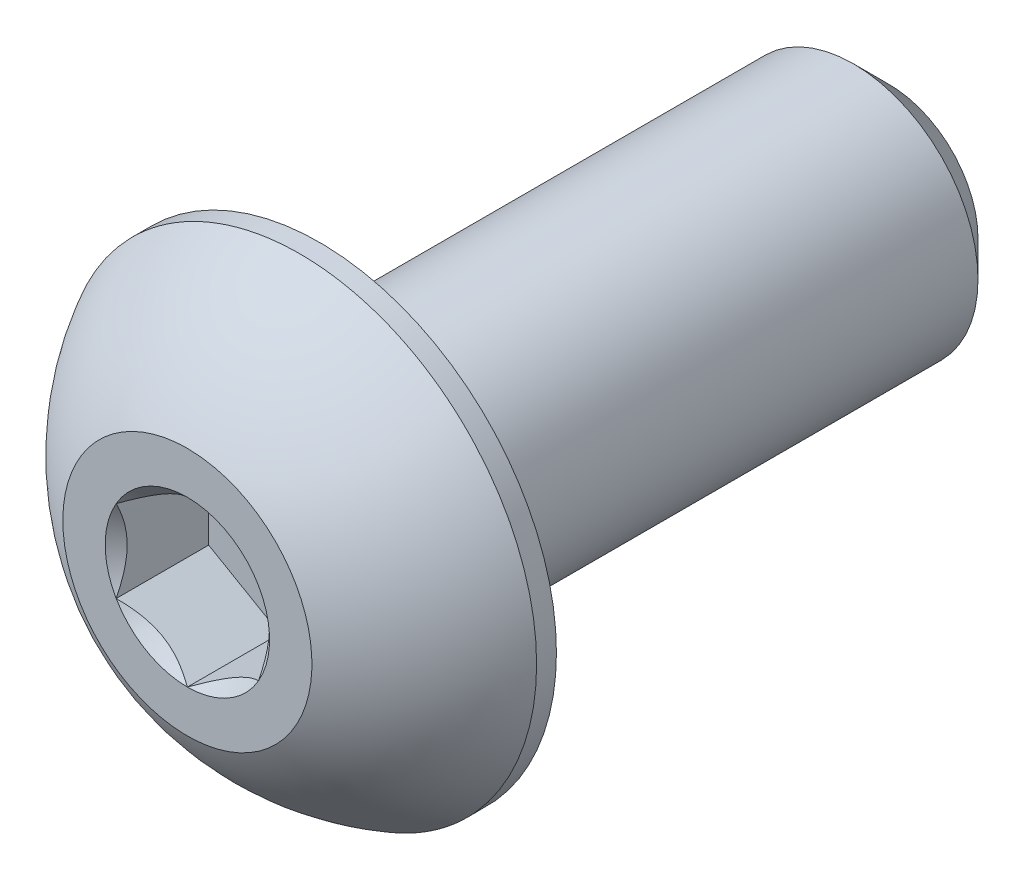
ISO-10303-21;
HEADER;
FILE_DESCRIPTION(('STEP AP214'),'2;1');
FILE_NAME('part.step','',(''),(''),'','','');
FILE_SCHEMA(('AUTOMOTIVE_DESIGN { 1 0 10303 214 1 1 1 1 }'));
ENDSEC;
DATA;
#1=APPLICATION_CONTEXT('core data for automotive mechanical design processes');
#2=APPLICATION_PROTOCOL_DEFINITION('international standard','automotive_design',2000,#1);
#3=PRODUCT_CONTEXT('',#1,'mechanical');
#4=PRODUCT('Part','Part','',(#3));
#5=PRODUCT_RELATED_PRODUCT_CATEGORY('part','',(#4));
#6=PRODUCT_DEFINITION_FORMATION('','',#4);
#7=PRODUCT_DEFINITION_CONTEXT('part definition',#1,'design');
#8=PRODUCT_DEFINITION('design','',#6,#7);
#9=PRODUCT_DEFINITION_SHAPE('','',#8);
#10=(LENGTH_UNIT() NAMED_UNIT(*) SI_UNIT(.MILLI.,.METRE.));
#11=(NAMED_UNIT(*) PLANE_ANGLE_UNIT() SI_UNIT($,.RADIAN.));
#12=(NAMED_UNIT(*) SI_UNIT($,.STERADIAN.) SOLID_ANGLE_UNIT());
#13=UNCERTAINTY_MEASURE_WITH_UNIT(LENGTH_MEASURE(1.E-05),#10,'distance_accuracy_value','');
#14=(GEOMETRIC_REPRESENTATION_CONTEXT(3) GLOBAL_UNCERTAINTY_ASSIGNED_CONTEXT((#13)) GLOBAL_UNIT_ASSIGNED_CONTEXT((#10,
#11,#12)) REPRESENTATION_CONTEXT('',''));
#15=CARTESIAN_POINT('',(0.,0.,0.));
#16=DIRECTION('',(0.,0.,1.));
#17=DIRECTION('',(1.,0.,0.));
#18=AXIS2_PLACEMENT_3D('',#15,#16,#17);
#19=CARTESIAN_POINT('',(1.190625,-0.687407664253898,-1.54686));
#20=DIRECTION('',(1.,0.,0.));
#21=DIRECTION('',(0.,0.,-1.));
#22=AXIS2_PLACEMENT_3D('',#19,#20,#21);
#23=PLANE('',#22);
#24=CARTESIAN_POINT('',(1.190625,0.687407664259233,-7.3339844687733E-12));
#25=CARTESIAN_POINT('',(1.190625,0.640463282058557,-0.0234502898053729));
#26=CARTESIAN_POINT('',(1.190625,0.59273899138342,-0.0455313138724906));
#27=CARTESIAN_POINT('',(1.190625,0.495406225240185,-0.0860062769801569));
#28=CARTESIAN_POINT('',(1.190625,0.445787629548574,-0.104375663617782));
#29=CARTESIAN_POINT('',(1.190625,0.345116375780404,-0.136095646290021));
#30=CARTESIAN_POINT('',(1.190625,0.294069215524812,-0.149463227506415));
#31=CARTESIAN_POINT('',(1.190625,0.190855854747494,-0.170043196665587));
#32=CARTESIAN_POINT('',(1.190625,0.138693633062727,-0.177274618626966));
#33=CARTESIAN_POINT('',(1.190625,0.0719511129764623,-0.182105338423632));
#34=CARTESIAN_POINT('',(1.190625,0.0575681066386955,-0.182886314662907));
#35=CARTESIAN_POINT('',(1.190625,0.0287907386926829,-0.183928904231108));
#36=CARTESIAN_POINT('',(1.190625,0.0143963875093465,-0.184190799693201));
#37=CARTESIAN_POINT('',(1.190625,-0.0361321030415034,-0.184189145960145));
#38=CARTESIAN_POINT('',(1.190625,-0.0722770331313801,-0.182535286211369));
#39=CARTESIAN_POINT('',(1.190625,-0.144284982569764,-0.176018069262139));
#40=CARTESIAN_POINT('',(1.190625,-0.180147787625385,-0.17115247351411));
#41=CARTESIAN_POINT('',(1.190625,-0.287258251635286,-0.152042262333456));
#42=CARTESIAN_POINT('',(1.190625,-0.357725297303742,-0.133287464347425));
#43=CARTESIAN_POINT('',(1.190625,-0.471552892405715,-0.0949199784628261));
#44=CARTESIAN_POINT('',(1.190625,-0.515840765871925,-0.0778592533991065));
#45=CARTESIAN_POINT('',(1.190625,-0.602739573087872,-0.0408831575921345));
#46=CARTESIAN_POINT('',(1.190625,-0.64536213992437,-0.0209953241872319));
#47=CARTESIAN_POINT('',(1.190625,-0.687407664259233,-7.3341207716749E-12));
#48=B_SPLINE_CURVE_WITH_KNOTS('',3,(#24,#25,#26,#27,#28,#29,#30,#31,#32,#33,#34,#35,#36,#37,#38,
#39,#40,#41,#42,#43,#44,#45,#46,#47),.UNSPECIFIED.,.F.,.F.,(4,2,2,2,2,2,2,2,2,2,2,4),(0.,
0.15753540310306,0.316081041460021,0.474083294580132,0.631593623087315,0.674799715051238,
0.71798231699486,0.826362160341962,0.934817623221276,1.1526245104714,1.29491478051943,
1.43590359047286),.UNSPECIFIED.);
#49=CARTESIAN_POINT('',(1.19062500000866,0.687407664251565,-3.66699461121871E-12));
#50=VERTEX_POINT('',#49);
#51=CARTESIAN_POINT('',(1.19062500000433,-0.687407664256399,-5.00084731799153E-12));
#52=VERTEX_POINT('',#51);
#53=EDGE_CURVE('E20',#50,#52,#48,.T.);
#54=ORIENTED_EDGE('',*,*,#53,.F.);
#55=DIRECTION('',(0.,0.,1.));
#56=VECTOR('',#55,1.);
#57=CARTESIAN_POINT('',(1.190625,0.687407664253899,-1.54686));
#58=LINE('',#57,#56);
#59=CARTESIAN_POINT('',(1.190625,0.687407664253899,-1.54686));
#60=VERTEX_POINT('',#59);
#61=EDGE_CURVE('E68',#50,#60,#58,.F.);
#62=ORIENTED_EDGE('',*,*,#61,.T.);
#63=DIRECTION('',(0.,1.,0.));
#64=VECTOR('',#63,1.);
#65=CARTESIAN_POINT('',(1.190625,-0.687407664253898,-1.54686));
#66=LINE('',#65,#64);
#67=CARTESIAN_POINT('',(1.190625,-0.687407664253898,-1.54686));
#68=VERTEX_POINT('',#67);
#69=EDGE_CURVE('E74',#68,#60,#66,.T.);
#70=ORIENTED_EDGE('',*,*,#69,.F.);
#71=DIRECTION('',(0.,0.,1.));
#72=VECTOR('',#71,1.);
#73=CARTESIAN_POINT('',(1.190625,-0.687407664253898,-1.54686));
#74=LINE('',#73,#72);
#75=EDGE_CURVE('E71',#68,#52,#74,.T.);
#76=ORIENTED_EDGE('',*,*,#75,.T.);
#77=EDGE_LOOP('',(#54,#62,#70,#76));
#78=FACE_BOUND('',#77,.T.);
#79=ADVANCED_FACE('F16',(#78),#23,.F.);
#80=CARTESIAN_POINT('',(1.190625,-0.687407664253898,-1.54686));
#81=DIRECTION('',(0.,0.,1.));
#82=DIRECTION('',(1.,0.,0.));
#83=AXIS2_PLACEMENT_3D('',#80,#81,#82);
#84=PLANE('',#83);
#85=DIRECTION('',(0.,1.,0.));
#86=VECTOR('',#85,1.);
#87=CARTESIAN_POINT('',(-1.190625,0.687407664253898,-1.54686));
#88=LINE('',#87,#86);
#89=CARTESIAN_POINT('',(-1.190625,0.687407664253898,-1.54686));
#90=VERTEX_POINT('',#89);
#91=CARTESIAN_POINT('',(-1.190625,-0.687407664253898,-1.54686));
#92=VERTEX_POINT('',#91);
#93=EDGE_CURVE('E217',#90,#92,#88,.F.);
#94=ORIENTED_EDGE('',*,*,#93,.T.);
#95=DIRECTION('',(0.866025403784439,-0.5,0.));
#96=VECTOR('',#95,1.);
#97=CARTESIAN_POINT('',(-1.190625,-0.687407664253898,-1.54686));
#98=LINE('',#97,#96);
#99=CARTESIAN_POINT('',(0.,-1.3748153285078,-1.54686));
#100=VERTEX_POINT('',#99);
#101=EDGE_CURVE('E243',#92,#100,#98,.T.);
#102=ORIENTED_EDGE('',*,*,#101,.T.);
#103=DIRECTION('',(0.866025403784438,0.5,0.));
#104=VECTOR('',#103,1.);
#105=CARTESIAN_POINT('',(0.,-1.3748153285078,-1.54686));
#106=LINE('',#105,#104);
#107=EDGE_CURVE('E232',#100,#68,#106,.T.);
#108=ORIENTED_EDGE('',*,*,#107,.T.);
#109=ORIENTED_EDGE('',*,*,#69,.T.);
#110=DIRECTION('',(-0.866025403784439,0.5,0.));
#111=VECTOR('',#110,1.);
#112=CARTESIAN_POINT('',(1.190625,0.687407664253898,-1.54686));
#113=LINE('',#112,#111);
#114=CARTESIAN_POINT('',(0.,1.3748153285078,-1.54686));
#115=VERTEX_POINT('',#114);
#116=EDGE_CURVE('E81',#60,#115,#113,.T.);
#117=ORIENTED_EDGE('',*,*,#116,.T.);
#118=DIRECTION('',(-0.866025403784438,-0.500000000000001,0.));
#119=VECTOR('',#118,1.);
#120=CARTESIAN_POINT('',(0.,1.3748153285078,-1.54686));
#121=LINE('',#120,#119);
#122=EDGE_CURVE('E82',#115,#90,#121,.T.);
#123=ORIENTED_EDGE('',*,*,#122,.T.);
#124=EDGE_LOOP('',(#94,#102,#108,#109,#117,#123));
#125=FACE_BOUND('',#124,.T.);
#126=ADVANCED_FACE('F161',(#125),#84,.T.);
#127=CARTESIAN_POINT('',(-1.190625,-0.687407664253898,-1.54686));
#128=DIRECTION('',(-0.5,-0.866025403784439,0.));
#129=DIRECTION('',(0.866025403784439,-0.5,0.));
#130=AXIS2_PLACEMENT_3D('',#127,#128,#129);
#131=PLANE('',#130);
#132=CARTESIAN_POINT('',(-1.190625000005,-0.687407664251009,-7.11226691489281E-12));
#133=CARTESIAN_POINT('',(-1.14970263916546,-0.711034200297593,-0.0236038646769938));
#134=CARTESIAN_POINT('',(-1.10809605277264,-0.73505577415155,-0.0458212036469661));
#135=CARTESIAN_POINT('',(-1.02325595337568,-0.784038228376462,-0.0865002027034878));
#136=CARTESIAN_POINT('',(-0.980014376482455,-0.809003764435948,-0.104939236403414));
#137=CARTESIAN_POINT('',(-0.892819863395944,-0.859345540038303,-0.136525429378763));
#138=CARTESIAN_POINT('',(-0.848889120958567,-0.884708966010223,-0.149751957854468));
#139=CARTESIAN_POINT('',(-0.760060747152133,-0.935994051539044,-0.170129928587292));
#140=CARTESIAN_POINT('',(-0.715165827466802,-0.961914145504617,-0.177296576577547));
#141=CARTESIAN_POINT('',(-0.637785345269273,-1.00658978773138,-0.183763131592925));
#142=CARTESIAN_POINT('',(-0.605399644682964,-1.02528768068278,-0.184720050380429));
#143=CARTESIAN_POINT('',(-0.540685248506871,-1.06265055473549,-0.183105270887928));
#144=CARTESIAN_POINT('',(-0.508356567088664,-1.08131552765484,-0.180532793146412));
#145=CARTESIAN_POINT('',(-0.444011323014015,-1.11846527164241,-0.172007928559528));
#146=CARTESIAN_POINT('',(-0.411995078792538,-1.13694985886212,-0.166052398779168));
#147=CARTESIAN_POINT('',(-0.348497138622973,-1.17361041171201,-0.151082179001727));
#148=CARTESIAN_POINT('',(-0.317015678144512,-1.19178624139373,-0.142066176329257));
#149=CARTESIAN_POINT('',(-0.236423425587284,-1.23831620010224,-0.115320764312442));
#150=CARTESIAN_POINT('',(-0.187819783695938,-1.26637752583181,-0.0955839989520929));
#151=CARTESIAN_POINT('',(-0.0925140444359303,-1.32140232004889,-0.0511268607854128));
#152=CARTESIAN_POINT('',(-0.0458063370539672,-1.3483690274791,-0.0264227108261042));
#153=CARTESIAN_POINT('',(5.00481812795174E-12,-1.37481532851069,-7.11205201533462E-12));
#154=B_SPLINE_CURVE_WITH_KNOTS('',3,(#132,#133,#134,#135,#136,#137,#138,#139,#140,#141,#142,
#143,#144,#145,#146,#147,#148,#149,#150,#151,#152,#153),.UNSPECIFIED.,.F.,.F.,(4,2,2,2,2,2,2,2,
2,2,4),(0.,0.158570945741683,0.318065397746423,0.475027617147274,0.631594800912474,
0.743660160555296,0.855750273635721,0.96794469177711,1.08018729245045,1.2583629102598,
1.43596581389991),.UNSPECIFIED.);
#155=CARTESIAN_POINT('',(-1.19062500000433,-0.687407664256399,-5.0007317979836E-12));
#156=VERTEX_POINT('',#155);
#157=CARTESIAN_POINT('',(-6.15870822370063E-12,-1.37481532851424,-3.5559820357246E-12));
#158=VERTEX_POINT('',#157);
#159=EDGE_CURVE('E163',#156,#158,#154,.T.);
#160=ORIENTED_EDGE('',*,*,#159,.T.);
#161=DIRECTION('',(0.,0.,1.));
#162=VECTOR('',#161,1.);
#163=CARTESIAN_POINT('',(0.,-1.3748153285078,-1.54686));
#164=LINE('',#163,#162);
#165=EDGE_CURVE('E226',#158,#100,#164,.F.);
#166=ORIENTED_EDGE('',*,*,#165,.T.);
#167=ORIENTED_EDGE('',*,*,#101,.F.);
#168=DIRECTION('',(0.,0.,1.));
#169=VECTOR('',#168,1.);
#170=CARTESIAN_POINT('',(-1.190625,-0.687407664253898,-1.54686));
#171=LINE('',#170,#169);
#172=EDGE_CURVE('E213',#92,#156,#171,.T.);
#173=ORIENTED_EDGE('',*,*,#172,.T.);
#174=EDGE_LOOP('',(#160,#166,#167,#173));
#175=FACE_BOUND('',#174,.T.);
#176=ADVANCED_FACE('F157',(#175),#131,.F.);
#177=CARTESIAN_POINT('',(0.,-1.3748153285078,-1.54686));
#178=DIRECTION('',(0.5,-0.866025403784438,0.));
#179=DIRECTION('',(0.866025403784438,0.5,0.));
#180=AXIS2_PLACEMENT_3D('',#177,#178,#179);
#181=PLANE('',#180);
#182=CARTESIAN_POINT('',(-5.00401088023849E-12,-1.37481532851069,-7.11178287157497E-12));
#183=CARTESIAN_POINT('',(0.0409223608345363,-1.3511887924641,-0.023603864676993));
#184=CARTESIAN_POINT('',(0.0825289472273579,-1.32716721861015,-0.0458212036469651));
#185=CARTESIAN_POINT('',(0.167369046624322,-1.27818476438523,-0.0865002027034866));
#186=CARTESIAN_POINT('',(0.210610623517543,-1.25321922832575,-0.104939236403413));
#187=CARTESIAN_POINT('',(0.297805136604054,-1.20287745272339,-0.136525429378762));
#188=CARTESIAN_POINT('',(0.341735879041432,-1.17751402675147,-0.149751957854467));
#189=CARTESIAN_POINT('',(0.430564252847866,-1.12622894122265,-0.170129928587291));
#190=CARTESIAN_POINT('',(0.475459172533197,-1.10030884725708,-0.177296576577546));
#191=CARTESIAN_POINT('',(0.552839654730727,-1.05563320503031,-0.183763131592925));
#192=CARTESIAN_POINT('',(0.585225355317036,-1.03693531207891,-0.184720050380429));
#193=CARTESIAN_POINT('',(0.649939751493129,-0.9995724380262,-0.183105270887928));
#194=CARTESIAN_POINT('',(0.682268432911337,-0.980907465106852,-0.180532793146412));
#195=CARTESIAN_POINT('',(0.746613676985986,-0.943757721119281,-0.172007928559527));
#196=CARTESIAN_POINT('',(0.778629921207463,-0.925273133899571,-0.166052398779167));
#197=CARTESIAN_POINT('',(0.842127861377027,-0.888612581049686,-0.151082179001727));
#198=CARTESIAN_POINT('',(0.873609321855487,-0.870436751367964,-0.142066176329257));
#199=CARTESIAN_POINT('',(0.954201574412646,-0.823906792659491,-0.115320764312466));
#200=CARTESIAN_POINT('',(1.00280521630393,-0.795845466929964,-0.0955839989521483));
#201=CARTESIAN_POINT('',(1.0981109555638,-0.740820672712956,-0.0511268607855445));
#202=CARTESIAN_POINT('',(1.14481866294571,-0.713853965282785,-0.0264227108262798));
#203=CARTESIAN_POINT('',(1.19062500000462,-0.687407664251231,-7.33463655303277E-12));
#204=B_SPLINE_CURVE_WITH_KNOTS('',3,(#182,#183,#184,#185,#186,#187,#188,#189,#190,#191,#192,
#193,#194,#195,#196,#197,#198,#199,#200,#201,#202,#203),.UNSPECIFIED.,.F.,.F.,(4,2,2,2,2,2,2,2,
2,2,4),(0.,0.158570945741681,0.318065397746421,0.475027617147272,0.631594800912474,
0.743660160555296,0.855750273635722,0.96794469177711,1.08018729245045,1.25836291025955,
1.43596581389941),.UNSPECIFIED.);
#205=EDGE_CURVE('E91',#158,#52,#204,.T.);
#206=ORIENTED_EDGE('',*,*,#205,.T.);
#207=ORIENTED_EDGE('',*,*,#75,.F.);
#208=ORIENTED_EDGE('',*,*,#107,.F.);
#209=ORIENTED_EDGE('',*,*,#165,.F.);
#210=EDGE_LOOP('',(#206,#207,#208,#209));
#211=FACE_BOUND('',#210,.T.);
#212=ADVANCED_FACE('F152',(#211),#181,.F.);
#213=CARTESIAN_POINT('',(1.190625,0.687407664253898,-1.54686));
#214=DIRECTION('',(0.5,0.866025403784439,0.));
#215=DIRECTION('',(-0.866025403784439,0.5,0.));
#216=AXIS2_PLACEMENT_3D('',#213,#214,#215);
#217=PLANE('',#216);
#218=CARTESIAN_POINT('',(1.19062500000462,0.687407664251231,-7.33437717370688E-12));
#219=CARTESIAN_POINT('',(1.1497026391651,0.711034200297802,-0.0236038646771912));
#220=CARTESIAN_POINT('',(1.1080960527723,0.735055774151746,-0.0458212036471392));
#221=CARTESIAN_POINT('',(1.02325595337539,0.784038228376629,-0.0865002027036148));
#222=CARTESIAN_POINT('',(0.980014376482192,0.8090037644361,-0.10493923640352));
#223=CARTESIAN_POINT('',(0.892819863395734,0.859345540038425,-0.13652542937883));
#224=CARTESIAN_POINT('',(0.848889120958384,0.884708966010329,-0.149751957854517));
#225=CARTESIAN_POINT('',(0.760060747152006,0.935994051539118,-0.170129928587314));
#226=CARTESIAN_POINT('',(0.715165827466704,0.961914145504674,-0.177296576577559));
#227=CARTESIAN_POINT('',(0.637785345269205,1.00658978773142,-0.183763131592929));
#228=CARTESIAN_POINT('',(0.605399644682898,1.02528768068282,-0.18472005038043));
#229=CARTESIAN_POINT('',(0.540685248506807,1.06265055473553,-0.183105270887924));
#230=CARTESIAN_POINT('',(0.508356567088601,1.08131552765488,-0.180532793146406));
#231=CARTESIAN_POINT('',(0.444011323013955,1.11846527164245,-0.172007928559517));
#232=CARTESIAN_POINT('',(0.411995078792479,1.13694985886216,-0.166052398779156));
#233=CARTESIAN_POINT('',(0.348497138622918,1.17361041171204,-0.151082179001712));
#234=CARTESIAN_POINT('',(0.317015678144459,1.19178624139376,-0.142066176329241));
#235=CARTESIAN_POINT('',(0.236423425587241,1.23831620010227,-0.115320764312425));
#236=CARTESIAN_POINT('',(0.187819783695904,1.26637752583183,-0.0955839989520779));
#237=CARTESIAN_POINT('',(0.0925140444359133,1.3214023200489,-0.0511268607854038));
#238=CARTESIAN_POINT('',(0.0458063370539588,1.3483690274791,-0.0264227108260993));
#239=CARTESIAN_POINT('',(-5.00500883587113E-12,1.37481532851069,-7.11174099955472E-12));
#240=B_SPLINE_CURVE_WITH_KNOTS('',3,(#218,#219,#220,#221,#222,#223,#224,#225,#226,#227,#228,
#229,#230,#231,#232,#233,#234,#235,#236,#237,#238,#239),.UNSPECIFIED.,.F.,.F.,(4,2,2,2,2,2,2,2,
2,2,4),(0.,0.158570945741578,0.318065397746212,0.475027617146959,0.631594800912057,
0.743660160554875,0.855750273635295,0.96794469177668,1.08018729245002,1.25836291025933,
1.43596581389941),.UNSPECIFIED.);
#241=CARTESIAN_POINT('',(6.15862930115388E-12,1.37481532851424,-3.55585714870156E-12));
#242=VERTEX_POINT('',#241);
#243=EDGE_CURVE('E79',#50,#242,#240,.T.);
#244=ORIENTED_EDGE('',*,*,#243,.T.);
#245=DIRECTION('',(0.,0.,1.));
#246=VECTOR('',#245,1.);
#247=CARTESIAN_POINT('',(0.,1.3748153285078,-1.54686));
#248=LINE('',#247,#246);
#249=EDGE_CURVE('E220',#242,#115,#248,.F.);
#250=ORIENTED_EDGE('',*,*,#249,.T.);
#251=ORIENTED_EDGE('',*,*,#116,.F.);
#252=ORIENTED_EDGE('',*,*,#61,.F.);
#253=EDGE_LOOP('',(#244,#250,#251,#252));
#254=FACE_BOUND('',#253,.T.);
#255=ADVANCED_FACE('F76',(#254),#217,.F.);
#256=CARTESIAN_POINT('',(0.,1.3748153285078,-1.54686));
#257=DIRECTION('',(-0.500000000000001,0.866025403784438,0.));
#258=DIRECTION('',(-0.866025403784438,-0.500000000000001,0.));
#259=AXIS2_PLACEMENT_3D('',#256,#257,#258);
#260=PLANE('',#259);
#261=CARTESIAN_POINT('',(5.0036324711369E-12,1.37481532851069,-7.11193552624931E-12));
#262=CARTESIAN_POINT('',(-0.040922360834537,1.3511887924641,-0.0236038646769936));
#263=CARTESIAN_POINT('',(-0.0825289472273589,1.32716721861014,-0.0458212036469658));
#264=CARTESIAN_POINT('',(-0.167369046624323,1.27818476438523,-0.0865002027034875));
#265=CARTESIAN_POINT('',(-0.210610623517545,1.25321922832575,-0.104939236403414));
#266=CARTESIAN_POINT('',(-0.297805136604057,1.20287745272339,-0.136525429378763));
#267=CARTESIAN_POINT('',(-0.341735879041434,1.17751402675147,-0.149751957854468));
#268=CARTESIAN_POINT('',(-0.430564252847868,1.12622894122265,-0.170129928587292));
#269=CARTESIAN_POINT('',(-0.475459172533199,1.10030884725708,-0.177296576577547));
#270=CARTESIAN_POINT('',(-0.552839654730727,1.05563320503031,-0.183763131592925));
#271=CARTESIAN_POINT('',(-0.585225355317036,1.03693531207891,-0.18472005038043));
#272=CARTESIAN_POINT('',(-0.64993975149313,0.9995724380262,-0.183105270887928));
#273=CARTESIAN_POINT('',(-0.682268432911337,0.980907465106852,-0.180532793146412));
#274=CARTESIAN_POINT('',(-0.746613676985986,0.943757721119281,-0.172007928559528));
#275=CARTESIAN_POINT('',(-0.778629921207463,0.92527313389957,-0.166052398779168));
#276=CARTESIAN_POINT('',(-0.842127861377028,0.888612581049685,-0.151082179001727));
#277=CARTESIAN_POINT('',(-0.873609321855488,0.870436751367963,-0.142066176329257));
#278=CARTESIAN_POINT('',(-0.954201574412716,0.82390679265945,-0.115320764312442));
#279=CARTESIAN_POINT('',(-1.00280521630406,0.795845466929885,-0.095583998952093));
#280=CARTESIAN_POINT('',(-1.09811095556407,0.740820672712803,-0.0511268607854132));
#281=CARTESIAN_POINT('',(-1.14481866294603,0.713853965282597,-0.0264227108261046));
#282=CARTESIAN_POINT('',(-1.190625000005,0.687407664251009,-7.11256883288283E-12));
#283=B_SPLINE_CURVE_WITH_KNOTS('',3,(#261,#262,#263,#264,#265,#266,#267,#268,#269,#270,#271,
#272,#273,#274,#275,#276,#277,#278,#279,#280,#281,#282),.UNSPECIFIED.,.F.,.F.,(4,2,2,2,2,2,2,2,
2,2,4),(0.,0.158570945741683,0.318065397746423,0.475027617147274,0.631594800912475,
0.743660160555297,0.855750273635722,0.967944691777111,1.08018729245045,1.2583629102598,
1.43596581389991),.UNSPECIFIED.);
#284=CARTESIAN_POINT('',(-1.1906250000025,0.687407664262455,-3.55622701201348E-12));
#285=VERTEX_POINT('',#284);
#286=EDGE_CURVE('E39',#242,#285,#283,.T.);
#287=ORIENTED_EDGE('',*,*,#286,.T.);
#288=DIRECTION('',(0.,0.,1.));
#289=VECTOR('',#288,1.);
#290=CARTESIAN_POINT('',(-1.190625,0.687407664253898,-1.54686));
#291=LINE('',#290,#289);
#292=EDGE_CURVE('E167',#285,#90,#291,.F.);
#293=ORIENTED_EDGE('',*,*,#292,.T.);
#294=ORIENTED_EDGE('',*,*,#122,.F.);
#295=ORIENTED_EDGE('',*,*,#249,.F.);
#296=EDGE_LOOP('',(#287,#293,#294,#295));
#297=FACE_BOUND('',#296,.T.);
#298=ADVANCED_FACE('F151',(#297),#260,.F.);
#299=CARTESIAN_POINT('',(-1.190625,0.687407664253898,-1.54686));
#300=DIRECTION('',(-1.,0.,0.));
#301=DIRECTION('',(0.,0.,1.));
#302=AXIS2_PLACEMENT_3D('',#299,#300,#301);
#303=PLANE('',#302);
#304=CARTESIAN_POINT('',(-1.190625,0.687407664259677,-7.11228319583856E-12));
#305=CARTESIAN_POINT('',(-1.190625,0.640154592154,-0.0236038646760217));
#306=CARTESIAN_POINT('',(-1.190625,0.592111444433501,-0.0458212036445066));
#307=CARTESIAN_POINT('',(-1.190625,0.494146535958518,-0.0865002026966673));
#308=CARTESIAN_POINT('',(-1.190625,0.444215463826976,-0.104939236393717));
#309=CARTESIAN_POINT('',(-1.190625,0.343531912597786,-0.136525429361613));
#310=CARTESIAN_POINT('',(-1.190625,0.292805060642044,-0.149751957832793));
#311=CARTESIAN_POINT('',(-1.190625,0.190234889561206,-0.170129928554993));
#312=CARTESIAN_POINT('',(-1.190625,0.138394701618765,-0.177296576539151));
#313=CARTESIAN_POINT('',(-1.190625,0.0490434171390508,-0.183763131543683));
#314=CARTESIAN_POINT('',(-1.190625,0.0116476312210965,-0.184720050325996));
#315=CARTESIAN_POINT('',(-1.190625,-0.0630781169140674,-0.183105270821438));
#316=CARTESIAN_POINT('',(-1.190625,-0.100408062767349,-0.180532793073054));
#317=CARTESIAN_POINT('',(-1.190625,-0.174707550771,-0.172007928471223));
#318=CARTESIAN_POINT('',(-1.190625,-0.211676725224342,-0.166052398682782));
#319=CARTESIAN_POINT('',(-1.190625,-0.28499783095133,-0.151082178888462));
#320=CARTESIAN_POINT('',(-1.190625,-0.321349490328069,-0.142066176207194));
#321=CARTESIAN_POINT('',(-1.190625,-0.41440940770112,-0.11532076418956));
#322=CARTESIAN_POINT('',(-1.190625,-0.470532059105262,-0.0955839988460164));
#323=CARTESIAN_POINT('',(-1.190625,-0.580581647434072,-0.0511268607248482));
#324=CARTESIAN_POINT('',(-1.190625,-0.634515062244118,-0.0264227107942392));
#325=CARTESIAN_POINT('',(-1.190625,-0.687407664259678,-7.11174772281409E-12));
#326=B_SPLINE_CURVE_WITH_KNOTS('',3,(#304,#305,#306,#307,#308,#309,#310,#311,#312,#313,#314,
#315,#316,#317,#318,#319,#320,#321,#322,#323,#324,#325),.UNSPECIFIED.,.F.,.F.,(4,2,2,2,2,2,2,2,
2,2,4),(0.,0.158570945773991,0.31806539781105,0.47502761724292,0.631594801039114,
0.74366016072688,0.855750273852302,0.967944692038746,1.08018729275716,1.25836291039536,
1.43596581386376),.UNSPECIFIED.);
#327=EDGE_CURVE('E108',#285,#156,#326,.T.);
#328=ORIENTED_EDGE('',*,*,#327,.T.);
#329=ORIENTED_EDGE('',*,*,#172,.F.);
#330=ORIENTED_EDGE('',*,*,#93,.F.);
#331=ORIENTED_EDGE('',*,*,#292,.F.);
#332=EDGE_LOOP('',(#328,#329,#330,#331));
#333=FACE_BOUND('',#332,.T.);
#334=ADVANCED_FACE('F121',(#333),#303,.F.);
#335=CARTESIAN_POINT('',(0.,0.,5.6843418860808E-11));
#336=DIRECTION('',(0.,0.,1.));
#337=DIRECTION('',(1.,0.,0.));
#338=AXIS2_PLACEMENT_3D('',#335,#336,#337);
#339=CONICAL_SURFACE('',#338,1.37481532857464,0.78539816324422);
#340=ORIENTED_EDGE('',*,*,#159,.F.);
#341=CARTESIAN_POINT('',(0.,0.,0.));
#342=DIRECTION('',(0.,0.,1.));
#343=DIRECTION('',(1.,0.,0.));
#344=AXIS2_PLACEMENT_3D('',#341,#342,#343);
#345=CIRCLE('',#344,1.3748153285178);
#346=EDGE_CURVE('E105',#156,#158,#345,.T.);
#347=ORIENTED_EDGE('',*,*,#346,.T.);
#348=EDGE_LOOP('',(#340,#347));
#349=FACE_BOUND('',#348,.T.);
#350=ADVANCED_FACE('F168',(#349),#339,.F.);
#351=CARTESIAN_POINT('',(0.,0.,5.6843418860808E-11));
#352=DIRECTION('',(0.,0.,1.));
#353=DIRECTION('',(1.,0.,0.));
#354=AXIS2_PLACEMENT_3D('',#351,#352,#353);
#355=CONICAL_SURFACE('',#354,1.37481532857464,0.78539816324422);
#356=ORIENTED_EDGE('',*,*,#205,.F.);
#357=CARTESIAN_POINT('',(0.,0.,0.));
#358=DIRECTION('',(0.,0.,1.));
#359=DIRECTION('',(1.,0.,0.));
#360=AXIS2_PLACEMENT_3D('',#357,#358,#359);
#361=CIRCLE('',#360,1.3748153285178);
#362=EDGE_CURVE('E86',#158,#52,#361,.T.);
#363=ORIENTED_EDGE('',*,*,#362,.T.);
#364=EDGE_LOOP('',(#356,#363));
#365=FACE_BOUND('',#364,.T.);
#366=ADVANCED_FACE('F171',(#365),#355,.F.);
#367=CARTESIAN_POINT('',(0.,0.,5.6843418860808E-11));
#368=DIRECTION('',(0.,0.,1.));
#369=DIRECTION('',(1.,0.,0.));
#370=AXIS2_PLACEMENT_3D('',#367,#368,#369);
#371=CONICAL_SURFACE('',#370,1.37481532857464,0.785398163397448);
#372=CARTESIAN_POINT('',(0.,0.,0.));
#373=DIRECTION('',(0.,0.,1.));
#374=DIRECTION('',(1.,0.,0.));
#375=AXIS2_PLACEMENT_3D('',#372,#373,#374);
#376=CIRCLE('',#375,1.3748153285178);
#377=EDGE_CURVE('E59',#52,#50,#376,.T.);
#378=ORIENTED_EDGE('',*,*,#377,.T.);
#379=ORIENTED_EDGE('',*,*,#53,.T.);
#380=EDGE_LOOP('',(#378,#379));
#381=FACE_BOUND('',#380,.T.);
#382=ADVANCED_FACE('F84',(#381),#371,.F.);
#383=CARTESIAN_POINT('',(0.,0.,5.6843418860808E-11));
#384=DIRECTION('',(0.,0.,1.));
#385=DIRECTION('',(1.,0.,0.));
#386=AXIS2_PLACEMENT_3D('',#383,#384,#385);
#387=CONICAL_SURFACE('',#386,1.37481532857464,0.78539816324422);
#388=ORIENTED_EDGE('',*,*,#243,.F.);
#389=CARTESIAN_POINT('',(0.,0.,0.));
#390=DIRECTION('',(0.,0.,1.));
#391=DIRECTION('',(1.,0.,0.));
#392=AXIS2_PLACEMENT_3D('',#389,#390,#391);
#393=CIRCLE('',#392,1.3748153285178);
#394=EDGE_CURVE('E85',#50,#242,#393,.T.);
#395=ORIENTED_EDGE('',*,*,#394,.T.);
#396=EDGE_LOOP('',(#388,#395));
#397=FACE_BOUND('',#396,.T.);
#398=ADVANCED_FACE('F90',(#397),#387,.F.);
#399=CARTESIAN_POINT('',(0.,0.,5.6843418860808E-11));
#400=DIRECTION('',(0.,0.,1.));
#401=DIRECTION('',(1.,0.,0.));
#402=AXIS2_PLACEMENT_3D('',#399,#400,#401);
#403=CONICAL_SURFACE('',#402,1.37481532857464,0.78539816324422);
#404=ORIENTED_EDGE('',*,*,#286,.F.);
#405=CARTESIAN_POINT('',(0.,0.,0.));
#406=DIRECTION('',(0.,0.,1.));
#407=DIRECTION('',(1.,0.,0.));
#408=AXIS2_PLACEMENT_3D('',#405,#406,#407);
#409=CIRCLE('',#408,1.3748153285178);
#410=EDGE_CURVE('E97',#242,#285,#409,.T.);
#411=ORIENTED_EDGE('',*,*,#410,.T.);
#412=EDGE_LOOP('',(#404,#411));
#413=FACE_BOUND('',#412,.T.);
#414=ADVANCED_FACE('F128',(#413),#403,.F.);
#415=CARTESIAN_POINT('',(0.,0.,5.6843418860808E-11));
#416=DIRECTION('',(0.,0.,1.));
#417=DIRECTION('',(1.,0.,0.));
#418=AXIS2_PLACEMENT_3D('',#415,#416,#417);
#419=CONICAL_SURFACE('',#418,1.37481532857464,0.785398163397448);
#420=ORIENTED_EDGE('',*,*,#327,.F.);
#421=CARTESIAN_POINT('',(0.,0.,0.));
#422=DIRECTION('',(0.,0.,1.));
#423=DIRECTION('',(1.,0.,0.));
#424=AXIS2_PLACEMENT_3D('',#421,#422,#423);
#425=CIRCLE('',#424,1.3748153285178);
#426=EDGE_CURVE('E99',#285,#156,#425,.T.);
#427=ORIENTED_EDGE('',*,*,#426,.T.);
#428=EDGE_LOOP('',(#420,#427));
#429=FACE_BOUND('',#428,.T.);
#430=ADVANCED_FACE('F124',(#429),#419,.F.);
#431=CARTESIAN_POINT('',(0.,-2.0828,0.));
#432=DIRECTION('',(0.,0.,-1.));
#433=DIRECTION('',(-1.,0.,0.));
#434=AXIS2_PLACEMENT_3D('',#431,#432,#433);
#435=PLANE('',#434);
#436=CARTESIAN_POINT('',(0.,2.08280000000001,0.));
#437=CARTESIAN_POINT('',(0.05847849233583,2.08279964955751,0.));
#438=CARTESIAN_POINT('',(0.1169677316743,2.08033495906802,0.));
#439=CARTESIAN_POINT('',(0.233542013925656,2.07049222107249,0.));
#440=CARTESIAN_POINT('',(0.291626932389895,2.06311272298952,-1.14208916918056E-13));
#441=CARTESIAN_POINT('',(0.407066403078437,2.04347357042982,1.14390647819156E-13));
#442=CARTESIAN_POINT('',(0.464419646064358,2.03120616926137,4.28515618350387E-13));
#443=CARTESIAN_POINT('',(0.577920714063595,2.0018757718164,-4.28864086434404E-13));
#444=CARTESIAN_POINT('',(0.634067520906122,1.98480888388339,-1.60157708067462E-12));
#445=CARTESIAN_POINT('',(0.799856441441209,1.92664494895692,-2.66545692782177E-12));
#446=CARTESIAN_POINT('',(0.907126063890289,1.87853685590206,-1.19627345046152E-13));
#447=CARTESIAN_POINT('',(1.11205416146872,1.7649689527326,1.19631893068781E-13));
#448=CARTESIAN_POINT('',(1.20971227104399,1.69950848300556,-2.18712293503805E-12));
#449=CARTESIAN_POINT('',(1.3468690319131,1.58979377772641,-1.35724047694744E-12));
#450=CARTESIAN_POINT('',(1.39105872202678,1.55127257582819,-3.63554467335635E-13));
#451=CARTESIAN_POINT('',(1.47600546350942,1.47067486359071,3.63203946072229E-13));
#452=CARTESIAN_POINT('',(1.51676578338101,1.42860181691305,0.));
#453=CARTESIAN_POINT('',(1.59461501437442,1.34115140166136,0.));
#454=CARTESIAN_POINT('',(1.63170225401479,1.29577254489065,0.));
#455=CARTESIAN_POINT('',(1.70192581224869,1.20205596768788,0.));
#456=CARTESIAN_POINT('',(1.73506121377471,1.15371756438381,0.));
#457=CARTESIAN_POINT('',(1.82814772480765,1.00479011331021,0.));
#458=CARTESIAN_POINT('',(1.88186126044392,0.900196406139757,0.));
#459=CARTESIAN_POINT('',(1.97093345090814,0.683532191743629,0.));
#460=CARTESIAN_POINT('',(2.00629230177271,0.571461764387248,0.));
#461=CARTESIAN_POINT('',(2.05770260086486,0.342960890217552,0.));
#462=CARTESIAN_POINT('',(2.07375394598216,0.226530420123182,0.));
#463=CARTESIAN_POINT('',(2.08607696514552,-0.00737259839019178,0.));
#464=CARTESIAN_POINT('',(2.08234863919157,-0.124845146809195,0.));
#465=CARTESIAN_POINT('',(2.05523312105739,-0.357483099485424,0.));
#466=CARTESIAN_POINT('',(2.03184603386293,-0.472648516060309,0.));
#467=CARTESIAN_POINT('',(1.96603335681779,-0.697472732847859,0.));
#468=CARTESIAN_POINT('',(1.92360756362332,-0.80713147423231,0.));
#469=CARTESIAN_POINT('',(1.84668521542381,-0.965015724767342,0.));
#470=CARTESIAN_POINT('',(1.81881250111283,-1.01656829856542,0.));
#471=CARTESIAN_POINT('',(1.75882514747471,-1.11714494782897,0.));
#472=CARTESIAN_POINT('',(1.72671149189239,-1.16616960602346,0.));
#473=CARTESIAN_POINT('',(1.65848225123467,-1.26131606477624,0.));
#474=CARTESIAN_POINT('',(1.62236848476273,-1.30743916965849,0.));
#475=CARTESIAN_POINT('',(1.54636096354283,-1.39651664618537,0.));
#476=CARTESIAN_POINT('',(1.50646359443533,-1.43946791678723,0.));
#477=CARTESIAN_POINT('',(1.381594608913,-1.56298726774601,0.));
#478=CARTESIAN_POINT('',(1.29135551306095,-1.6383469721147,0.));
#479=CARTESIAN_POINT('',(1.09949524901307,-1.77281939637648,0.));
#480=CARTESIAN_POINT('',(0.99787451365771,-1.83193273381913,0.));
#481=CARTESIAN_POINT('',(0.839115074974893,-1.90719527514987,0.));
#482=CARTESIAN_POINT('',(0.785072428437968,-1.9300674184168,0.));
#483=CARTESIAN_POINT('',(0.675281640979554,-1.97116179322085,0.));
#484=CARTESIAN_POINT('',(0.619534921515806,-1.98938778788431,0.));
#485=CARTESIAN_POINT('',(0.506798135588199,-2.02104824910744,0.));
#486=CARTESIAN_POINT('',(0.449810185113749,-2.03449028190304,0.));
#487=CARTESIAN_POINT('',(0.334915492327247,-2.05652780316067,0.));
#488=CARTESIAN_POINT('',(0.277009026197124,-2.06512472109267,0.));
#489=CARTESIAN_POINT('',(0.182510674876192,-2.07511016898973,0.));
#490=CARTESIAN_POINT('',(0.146070088230166,-2.07799294305928,0.));
#491=CARTESIAN_POINT('',(0.073087733501955,-2.08183796806843,0.));
#492=CARTESIAN_POINT('',(0.0365459654197696,-2.08280021900804,0.));
#493=CARTESIAN_POINT('',(-0.058478492335829,-2.0827996495575,0.));
#494=CARTESIAN_POINT('',(-0.116967731674299,-2.08033495906801,0.));
#495=CARTESIAN_POINT('',(-0.233542013925655,-2.07049222107248,0.));
#496=CARTESIAN_POINT('',(-0.291626932389894,-2.06311272298952,-1.14456176507095E-13));
#497=CARTESIAN_POINT('',(-0.407066403078436,-2.04347357042981,1.14638300851273E-13));
#498=CARTESIAN_POINT('',(-0.464419646064357,-2.03120616926137,4.28524433604071E-13));
#499=CARTESIAN_POINT('',(-0.577920714063593,-2.00187577181639,-4.28872908856636E-13));
#500=CARTESIAN_POINT('',(-0.634067520906121,-1.98480888388338,-1.60136432873447E-12));
#501=CARTESIAN_POINT('',(-0.799856441441209,-1.92664494895691,-2.6658814175387E-12));
#502=CARTESIAN_POINT('',(-0.90712606389029,-1.87853685590206,-1.22205358030733E-13));
#503=CARTESIAN_POINT('',(-1.11205416146871,-1.76496895273259,1.22210004064911E-13));
#504=CARTESIAN_POINT('',(-1.20971227104399,-1.69950848300555,-2.17723481701725E-12));
#505=CARTESIAN_POINT('',(-1.3468690319131,-1.5897937777264,-1.35177812739466E-12));
#506=CARTESIAN_POINT('',(-1.39105872202678,-1.55127257582818,-3.62140196036097E-13));
#507=CARTESIAN_POINT('',(-1.47600546350942,-1.4706748635907,3.61791038343234E-13));
#508=CARTESIAN_POINT('',(-1.51676578338101,-1.42860181691305,0.));
#509=CARTESIAN_POINT('',(-1.59461501437442,-1.34115140166135,0.));
#510=CARTESIAN_POINT('',(-1.63170225401479,-1.29577254489065,0.));
#511=CARTESIAN_POINT('',(-1.70192581224869,-1.20205596768788,0.));
#512=CARTESIAN_POINT('',(-1.73506121377471,-1.15371756438381,0.));
#513=CARTESIAN_POINT('',(-1.82814772480765,-1.0047901133102,0.));
#514=CARTESIAN_POINT('',(-1.88186126044392,-0.900196406139753,0.));
#515=CARTESIAN_POINT('',(-1.97093345090814,-0.683532191743626,0.));
#516=CARTESIAN_POINT('',(-2.00629230177271,-0.571461764387246,0.));
#517=CARTESIAN_POINT('',(-2.05770260086486,-0.34296089021755,0.));
#518=CARTESIAN_POINT('',(-2.07375394598216,-0.226530420123179,0.));
#519=CARTESIAN_POINT('',(-2.08607696514552,0.00737259839019442,0.));
#520=CARTESIAN_POINT('',(-2.08234863919157,0.124845146809197,0.));
#521=CARTESIAN_POINT('',(-2.0552331210574,0.357483099485427,0.));
#522=CARTESIAN_POINT('',(-2.03184603386293,0.472648516060312,0.));
#523=CARTESIAN_POINT('',(-1.96603335681779,0.697472732847861,0.));
#524=CARTESIAN_POINT('',(-1.92360756362331,0.807131474232312,0.));
#525=CARTESIAN_POINT('',(-1.84668521542381,0.965015724767345,0.));
#526=CARTESIAN_POINT('',(-1.81881250111283,1.01656829856542,0.));
#527=CARTESIAN_POINT('',(-1.75882514747471,1.11714494782897,0.));
#528=CARTESIAN_POINT('',(-1.72671149189239,1.16616960602346,0.));
#529=CARTESIAN_POINT('',(-1.65848225123467,1.26131606477625,0.));
#530=CARTESIAN_POINT('',(-1.62236848476273,1.30743916965849,0.));
#531=CARTESIAN_POINT('',(-1.54636096354283,1.39651664618537,0.));
#532=CARTESIAN_POINT('',(-1.50646359443533,1.43946791678723,0.));
#533=CARTESIAN_POINT('',(-1.381594608913,1.56298726774602,0.));
#534=CARTESIAN_POINT('',(-1.29135551306095,1.63834697211471,0.));
#535=CARTESIAN_POINT('',(-1.09949524901307,1.77281939637648,0.));
#536=CARTESIAN_POINT('',(-0.99787451365771,1.83193273381913,0.));
#537=CARTESIAN_POINT('',(-0.839115074974894,1.90719527514987,0.));
#538=CARTESIAN_POINT('',(-0.78507242843797,1.9300674184168,0.));
#539=CARTESIAN_POINT('',(-0.675281640979556,1.97116179322086,0.));
#540=CARTESIAN_POINT('',(-0.619534921515808,1.98938778788432,0.));
#541=CARTESIAN_POINT('',(-0.5067981355882,2.02104824910744,0.));
#542=CARTESIAN_POINT('',(-0.449810185113751,2.03449028190305,0.));
#543=CARTESIAN_POINT('',(-0.334915492327249,2.05652780316068,0.));
#544=CARTESIAN_POINT('',(-0.277009026197126,2.06512472109267,0.));
#545=CARTESIAN_POINT('',(-0.182510674876194,2.07511016898974,0.));
#546=CARTESIAN_POINT('',(-0.146070088230167,2.07799294305929,0.));
#547=CARTESIAN_POINT('',(-0.0730877335019551,2.08183796806844,0.));
#548=CARTESIAN_POINT('',(-0.0365459654197692,2.08280021900804,0.));
#549=CARTESIAN_POINT('',(0.,2.08280000000001,0.));
#550=B_SPLINE_CURVE_WITH_KNOTS('',3,(#436,#437,#438,#439,#440,#441,#442,#443,#444,#445,#446,
#447,#448,#449,#450,#451,#452,#453,#454,#455,#456,#457,#458,#459,#460,#461,#462,#463,#464,#465,
#466,#467,#468,#469,#470,#471,#472,#473,#474,#475,#476,#477,#478,#479,#480,#481,#482,#483,#484,
#485,#486,#487,#488,#489,#490,#491,#492,#493,#494,#495,#496,#497,#498,#499,#500,#501,#502,#503,
#504,#505,#506,#507,#508,#509,#510,#511,#512,#513,#514,#515,#516,#517,#518,#519,#520,#521,#522,
#523,#524,#525,#526,#527,#528,#529,#530,#531,#532,#533,#534,#535,#536,#537,#538,#539,#540,#541,
#542,#543,#544,#545,#546,#547,#548,#549),.UNSPECIFIED.,.T.,.F.,(4,2,2,2,2,2,2,2,2,2,2,2,2,2,2,2,
2,2,2,2,2,2,2,2,2,2,2,2,2,2,2,2,2,2,2,2,2,2,2,2,2,2,2,2,2,2,2,2,2,2,2,2,2,2,2,2,4),(0.,
0.175401832982579,0.350855457752404,0.526588266899342,0.702463981631701,1.05337703234289,
1.40430342415511,1.57999654239793,1.75552026601269,1.93112350040239,2.1067674064878,
2.45768900179217,2.80860684901267,3.15952657027512,3.51044629153761,3.86136413875816,
4.21228573406248,4.38792964014763,4.56353287453705,4.73905659815158,4.91474971639419,
5.26567610820669,5.61658915891822,5.79246487365086,5.96819768279802,6.14365130756796,
6.31905314055069,6.42867001107339,6.5382868815961,6.71368871457868,6.8891423393485,
7.06487514849544,7.2407508632278,7.59166391393899,7.94259030575121,8.11828342399403,
8.29380714760878,8.46941038199849,8.6450542880839,8.99597588338826,9.34689373060877,
9.69781345187122,10.0487331731337,10.3996510203543,10.7505726156586,10.9262165217437,
11.1018197561332,11.2773434797477,11.4530365979903,11.8039629898028,12.1548760405143,
12.330751755247,12.5064845643941,12.6819381891641,12.8573400221468,12.9669568926695,
13.0765737631922),.UNSPECIFIED.);
#551=CARTESIAN_POINT('',(0.,2.08280000000001,0.));
#552=VERTEX_POINT('',#551);
#553=EDGE_CURVE('E269',#552,#552,#550,.T.);
#554=ORIENTED_EDGE('',*,*,#553,.F.);
#555=EDGE_LOOP('',(#554));
#556=FACE_BOUND('',#555,.T.);
#557=ORIENTED_EDGE('',*,*,#410,.F.);
#558=ORIENTED_EDGE('',*,*,#394,.F.);
#559=ORIENTED_EDGE('',*,*,#377,.F.);
#560=ORIENTED_EDGE('',*,*,#362,.F.);
#561=ORIENTED_EDGE('',*,*,#346,.F.);
#562=ORIENTED_EDGE('',*,*,#426,.F.);
#563=EDGE_LOOP('',(#557,#558,#559,#560,#561,#562));
#564=FACE_BOUND('',#563,.T.);
#565=ADVANCED_FACE('F94',(#556,#564),#435,.F.);
#566=CARTESIAN_POINT('',(0.,0.,-3.96380867816092));
#567=DIRECTION('',(0.,-1.,0.));
#568=DIRECTION('',(0.,0.,-1.));
#569=AXIS2_PLACEMENT_3D('',#566,#567,#568);
#570=SPHERICAL_SURFACE('',#569,4.47770421947049);
#571=ORIENTED_EDGE('',*,*,#553,.T.);
#572=EDGE_LOOP('',(#571));
#573=FACE_BOUND('',#572,.T.);
#574=CARTESIAN_POINT('',(0.,0.,-1.87833));
#575=DIRECTION('',(0.,0.,1.));
#576=DIRECTION('',(1.,0.,0.));
#577=AXIS2_PLACEMENT_3D('',#574,#575,#576);
#578=CIRCLE('',#577,3.9624);
#579=CARTESIAN_POINT('',(3.9624,0.,-1.87833));
#580=VERTEX_POINT('',#579);
#581=EDGE_CURVE('E267',#580,#580,#578,.F.);
#582=ORIENTED_EDGE('',*,*,#581,.F.);
#583=EDGE_LOOP('',(#582));
#584=FACE_BOUND('',#583,.T.);
#585=ADVANCED_FACE('F203',(#573,#584),#570,.T.);
#586=CARTESIAN_POINT('',(0.,0.,0.));
#587=DIRECTION('',(0.,0.,1.));
#588=DIRECTION('',(1.,0.,0.));
#589=AXIS2_PLACEMENT_3D('',#586,#587,#588);
#590=CYLINDRICAL_SURFACE('',#589,3.9624);
#591=ORIENTED_EDGE('',*,*,#581,.T.);
#592=EDGE_LOOP('',(#591));
#593=FACE_BOUND('',#592,.T.);
#594=CARTESIAN_POINT('',(0.,0.,-2.2098));
#595=DIRECTION('',(0.,0.,1.));
#596=DIRECTION('',(1.,0.,0.));
#597=AXIS2_PLACEMENT_3D('',#594,#595,#596);
#598=CIRCLE('',#597,3.9624);
#599=CARTESIAN_POINT('',(3.9624,0.,-2.2098));
#600=VERTEX_POINT('',#599);
#601=EDGE_CURVE('E264',#600,#600,#598,.T.);
#602=ORIENTED_EDGE('',*,*,#601,.T.);
#603=EDGE_LOOP('',(#602));
#604=FACE_BOUND('',#603,.T.);
#605=ADVANCED_FACE('F200',(#593,#604),#590,.T.);
#606=CARTESIAN_POINT('',(0.,-2.08280000000001,-11.7348));
#607=DIRECTION('',(0.,0.,-1.));
#608=DIRECTION('',(0.,1.,0.));
#609=AXIS2_PLACEMENT_3D('',#606,#607,#608);
#610=PLANE('',#609);
#611=CARTESIAN_POINT('',(0.,0.,-11.7347999999993));
#612=DIRECTION('',(0.,0.,1.));
#613=DIRECTION('',(1.,0.,0.));
#614=AXIS2_PLACEMENT_3D('',#611,#612,#613);
#615=CIRCLE('',#614,1.48748750001459);
#616=CARTESIAN_POINT('',(1.48748750001459,0.,-11.7347999999993));
#617=VERTEX_POINT('',#616);
#618=EDGE_CURVE('E261',#617,#617,#615,.T.);
#619=ORIENTED_EDGE('',*,*,#618,.F.);
#620=EDGE_LOOP('',(#619));
#621=FACE_BOUND('',#620,.T.);
#622=ADVANCED_FACE('F196',(#621),#610,.T.);
#623=CARTESIAN_POINT('',(0.,-3.9624,-2.2098));
#624=DIRECTION('',(0.,0.,1.));
#625=DIRECTION('',(1.,0.,0.));
#626=AXIS2_PLACEMENT_3D('',#623,#624,#625);
#627=PLANE('',#626);
#628=ORIENTED_EDGE('',*,*,#601,.F.);
#629=EDGE_LOOP('',(#628));
#630=FACE_BOUND('',#629,.T.);
#631=CARTESIAN_POINT('',(0.,0.,-2.2098));
#632=DIRECTION('',(0.,0.,-1.));
#633=DIRECTION('',(0.,1.,0.));
#634=AXIS2_PLACEMENT_3D('',#631,#632,#633);
#635=CIRCLE('',#634,2.0828);
#636=CARTESIAN_POINT('',(0.,2.0828,-2.2098));
#637=VERTEX_POINT('',#636);
#638=EDGE_CURVE('E30',#637,#637,#635,.T.);
#639=ORIENTED_EDGE('',*,*,#638,.F.);
#640=EDGE_LOOP('',(#639));
#641=FACE_BOUND('',#640,.T.);
#642=ADVANCED_FACE('F189',(#630,#641),#627,.F.);
#643=CARTESIAN_POINT('',(0.,0.,-11.1394874999178));
#644=DIRECTION('',(0.,0.,1.));
#645=DIRECTION('',(1.,0.,0.));
#646=AXIS2_PLACEMENT_3D('',#643,#644,#645);
#647=CONICAL_SURFACE('',#646,2.08280000009608,0.785398163397448);
#648=CARTESIAN_POINT('',(0.,0.,-11.1394875));
#649=DIRECTION('',(0.,0.,-1.));
#650=DIRECTION('',(0.,1.,0.));
#651=AXIS2_PLACEMENT_3D('',#648,#649,#650);
#652=CIRCLE('',#651,2.0828);
#653=CARTESIAN_POINT('',(0.,2.0828,-11.1394875));
#654=VERTEX_POINT('',#653);
#655=EDGE_CURVE('E10',#654,#654,#652,.F.);
#656=ORIENTED_EDGE('',*,*,#655,.F.);
#657=EDGE_LOOP('',(#656));
#658=FACE_BOUND('',#657,.T.);
#659=ORIENTED_EDGE('',*,*,#618,.T.);
#660=EDGE_LOOP('',(#659));
#661=FACE_BOUND('',#660,.T.);
#662=ADVANCED_FACE('F183',(#658,#661),#647,.T.);
#663=CARTESIAN_POINT('',(0.,0.,-11.7348));
#664=DIRECTION('',(0.,0.,-1.));
#665=DIRECTION('',(0.,1.,0.));
#666=AXIS2_PLACEMENT_3D('',#663,#664,#665);
#667=CYLINDRICAL_SURFACE('',#666,2.0828);
#668=ORIENTED_EDGE('',*,*,#655,.T.);
#669=EDGE_LOOP('',(#668));
#670=FACE_BOUND('',#669,.T.);
#671=ORIENTED_EDGE('',*,*,#638,.T.);
#672=EDGE_LOOP('',(#671));
#673=FACE_BOUND('',#672,.T.);
#674=ADVANCED_FACE('F181',(#670,#673),#667,.T.);
#675=CLOSED_SHELL('',(#79,#126,#176,#212,#255,#298,#334,#350,#366,#382,#398,#414,#430,#565,#585,
#605,#622,#642,#662,#674));
#676=MANIFOLD_SOLID_BREP('B1',#675);
#677=ADVANCED_BREP_SHAPE_REPRESENTATION('',(#18,#676),#14);
#678=SHAPE_DEFINITION_REPRESENTATION(#9,#677);
ENDSEC;
END-ISO-10303-21;
